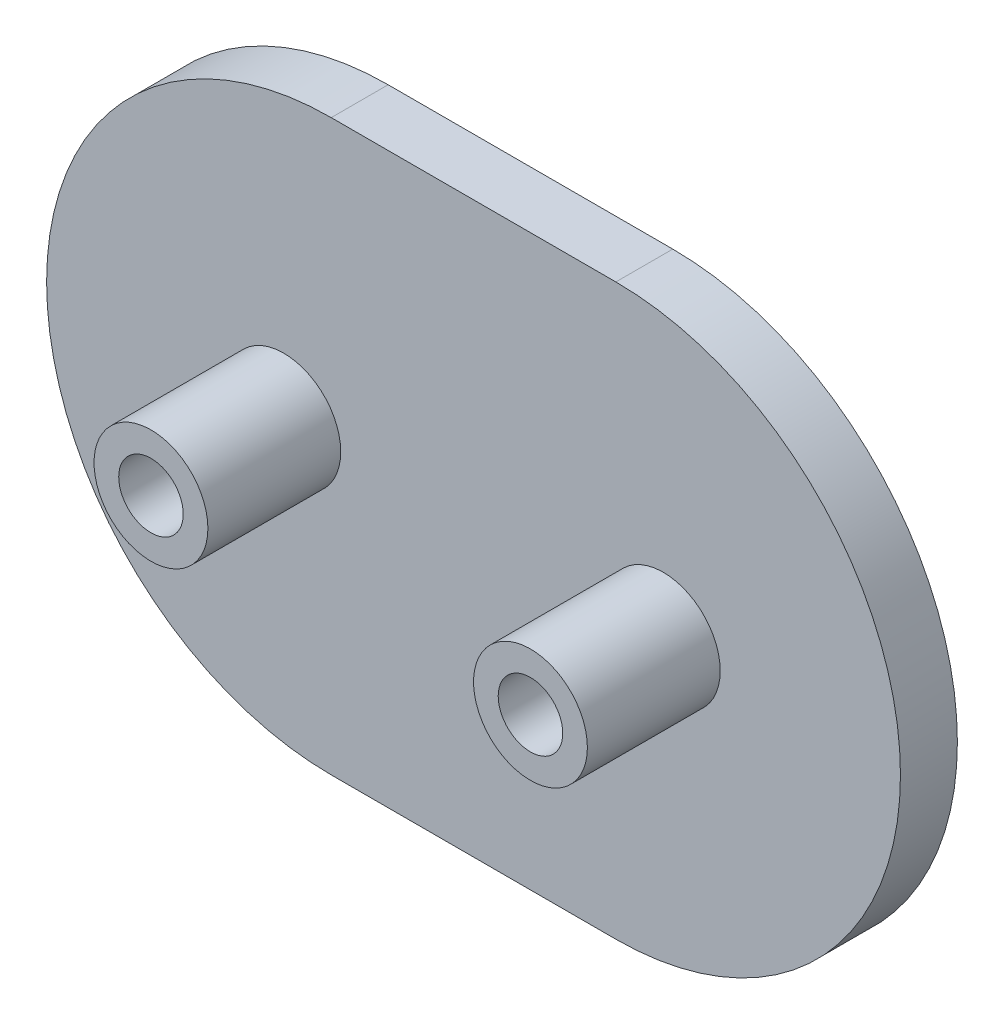
ISO-10303-21;
HEADER;
FILE_DESCRIPTION(('STEP AP214'),'2;1');
FILE_NAME('part.step','',(''),(''),'','','');
FILE_SCHEMA(('AUTOMOTIVE_DESIGN { 1 0 10303 214 1 1 1 1 }'));
ENDSEC;
DATA;
#1=APPLICATION_CONTEXT('core data for automotive mechanical design processes');
#2=APPLICATION_PROTOCOL_DEFINITION('international standard','automotive_design',2000,#1);
#3=PRODUCT_CONTEXT('',#1,'mechanical');
#4=PRODUCT('Part','Part','',(#3));
#5=PRODUCT_RELATED_PRODUCT_CATEGORY('part','',(#4));
#6=PRODUCT_DEFINITION_FORMATION('','',#4);
#7=PRODUCT_DEFINITION_CONTEXT('part definition',#1,'design');
#8=PRODUCT_DEFINITION('design','',#6,#7);
#9=PRODUCT_DEFINITION_SHAPE('','',#8);
#10=(LENGTH_UNIT() NAMED_UNIT(*) SI_UNIT(.MILLI.,.METRE.));
#11=(NAMED_UNIT(*) PLANE_ANGLE_UNIT() SI_UNIT($,.RADIAN.));
#12=(NAMED_UNIT(*) SI_UNIT($,.STERADIAN.) SOLID_ANGLE_UNIT());
#13=UNCERTAINTY_MEASURE_WITH_UNIT(LENGTH_MEASURE(1.E-05),#10,'distance_accuracy_value','');
#14=(GEOMETRIC_REPRESENTATION_CONTEXT(3) GLOBAL_UNCERTAINTY_ASSIGNED_CONTEXT((#13)) GLOBAL_UNIT_ASSIGNED_CONTEXT((#10,
#11,#12)) REPRESENTATION_CONTEXT('',''));
#15=CARTESIAN_POINT('',(0.,0.,0.));
#16=DIRECTION('',(0.,0.,1.));
#17=DIRECTION('',(1.,0.,0.));
#18=AXIS2_PLACEMENT_3D('',#15,#16,#17);
#19=CARTESIAN_POINT('',(0.,-15.,3.));
#20=DIRECTION('',(0.,1.,0.));
#21=DIRECTION('',(0.,0.,1.));
#22=AXIS2_PLACEMENT_3D('',#19,#20,#21);
#23=PLANE('',#22);
#24=DIRECTION('',(1.,0.,0.));
#25=VECTOR('',#24,1.);
#26=CARTESIAN_POINT('',(0.,-15.,0.));
#27=LINE('',#26,#25);
#28=CARTESIAN_POINT('',(-7.5,-15.,0.));
#29=VERTEX_POINT('',#28);
#30=CARTESIAN_POINT('',(7.5,-15.,0.));
#31=VERTEX_POINT('',#30);
#32=EDGE_CURVE('E107',#29,#31,#27,.T.);
#33=ORIENTED_EDGE('',*,*,#32,.T.);
#34=DIRECTION('',(0.,0.,-1.));
#35=VECTOR('',#34,1.);
#36=CARTESIAN_POINT('',(7.5,-15.,3.));
#37=LINE('',#36,#35);
#38=CARTESIAN_POINT('',(7.5,-15.,3.));
#39=VERTEX_POINT('',#38);
#40=EDGE_CURVE('E99',#39,#31,#37,.T.);
#41=ORIENTED_EDGE('',*,*,#40,.F.);
#42=DIRECTION('',(1.,0.,0.));
#43=VECTOR('',#42,1.);
#44=CARTESIAN_POINT('',(0.,-15.,3.));
#45=LINE('',#44,#43);
#46=CARTESIAN_POINT('',(-7.5,-15.,3.));
#47=VERTEX_POINT('',#46);
#48=EDGE_CURVE('E89',#47,#39,#45,.T.);
#49=ORIENTED_EDGE('',*,*,#48,.F.);
#50=DIRECTION('',(0.,0.,-1.));
#51=VECTOR('',#50,1.);
#52=CARTESIAN_POINT('',(-7.5,-15.,3.));
#53=LINE('',#52,#51);
#54=EDGE_CURVE('E103',#47,#29,#53,.T.);
#55=ORIENTED_EDGE('',*,*,#54,.T.);
#56=EDGE_LOOP('',(#33,#41,#49,#55));
#57=FACE_BOUND('',#56,.T.);
#58=ADVANCED_FACE('F39',(#57),#23,.F.);
#59=CARTESIAN_POINT('',(7.5,0.,3.));
#60=DIRECTION('',(0.,0.,-1.));
#61=DIRECTION('',(-1.,0.,0.));
#62=AXIS2_PLACEMENT_3D('',#59,#60,#61);
#63=CYLINDRICAL_SURFACE('',#62,15.);
#64=CARTESIAN_POINT('',(7.5,0.,0.));
#65=DIRECTION('',(0.,0.,1.));
#66=DIRECTION('',(1.,0.,0.));
#67=AXIS2_PLACEMENT_3D('',#64,#65,#66);
#68=CIRCLE('',#67,15.);
#69=CARTESIAN_POINT('',(7.5,15.,0.));
#70=VERTEX_POINT('',#69);
#71=EDGE_CURVE('E95',#31,#70,#68,.T.);
#72=ORIENTED_EDGE('',*,*,#71,.T.);
#73=DIRECTION('',(0.,0.,-1.));
#74=VECTOR('',#73,1.);
#75=CARTESIAN_POINT('',(7.5,15.,3.));
#76=LINE('',#75,#74);
#77=CARTESIAN_POINT('',(7.5,15.,3.));
#78=VERTEX_POINT('',#77);
#79=EDGE_CURVE('E93',#78,#70,#76,.T.);
#80=ORIENTED_EDGE('',*,*,#79,.F.);
#81=CARTESIAN_POINT('',(7.5,0.,3.));
#82=DIRECTION('',(0.,0.,1.));
#83=DIRECTION('',(1.,0.,0.));
#84=AXIS2_PLACEMENT_3D('',#81,#82,#83);
#85=CIRCLE('',#84,15.);
#86=EDGE_CURVE('E84',#39,#78,#85,.T.);
#87=ORIENTED_EDGE('',*,*,#86,.F.);
#88=ORIENTED_EDGE('',*,*,#40,.T.);
#89=EDGE_LOOP('',(#72,#80,#87,#88));
#90=FACE_BOUND('',#89,.T.);
#91=ADVANCED_FACE('F94',(#90),#63,.T.);
#92=CARTESIAN_POINT('',(0.,15.,3.));
#93=DIRECTION('',(0.,1.,0.));
#94=DIRECTION('',(0.,0.,1.));
#95=AXIS2_PLACEMENT_3D('',#92,#93,#94);
#96=PLANE('',#95);
#97=DIRECTION('',(1.,0.,0.));
#98=VECTOR('',#97,1.);
#99=CARTESIAN_POINT('',(0.,15.,0.));
#100=LINE('',#99,#98);
#101=CARTESIAN_POINT('',(-7.5,15.,0.));
#102=VERTEX_POINT('',#101);
#103=EDGE_CURVE('E112',#102,#70,#100,.T.);
#104=ORIENTED_EDGE('',*,*,#103,.F.);
#105=DIRECTION('',(0.,0.,-1.));
#106=VECTOR('',#105,1.);
#107=CARTESIAN_POINT('',(-7.5,15.,3.));
#108=LINE('',#107,#106);
#109=CARTESIAN_POINT('',(-7.5,15.,3.));
#110=VERTEX_POINT('',#109);
#111=EDGE_CURVE('E73',#110,#102,#108,.T.);
#112=ORIENTED_EDGE('',*,*,#111,.F.);
#113=DIRECTION('',(1.,0.,0.));
#114=VECTOR('',#113,1.);
#115=CARTESIAN_POINT('',(0.,15.,3.));
#116=LINE('',#115,#114);
#117=EDGE_CURVE('E87',#110,#78,#116,.T.);
#118=ORIENTED_EDGE('',*,*,#117,.T.);
#119=ORIENTED_EDGE('',*,*,#79,.T.);
#120=EDGE_LOOP('',(#104,#112,#118,#119));
#121=FACE_BOUND('',#120,.T.);
#122=ADVANCED_FACE('F101',(#121),#96,.T.);
#123=CARTESIAN_POINT('',(-7.5,0.,3.));
#124=DIRECTION('',(0.,0.,-1.));
#125=DIRECTION('',(-1.,0.,0.));
#126=AXIS2_PLACEMENT_3D('',#123,#124,#125);
#127=CYLINDRICAL_SURFACE('',#126,15.);
#128=CARTESIAN_POINT('',(-7.5,0.,0.));
#129=DIRECTION('',(0.,0.,1.));
#130=DIRECTION('',(1.,0.,0.));
#131=AXIS2_PLACEMENT_3D('',#128,#129,#130);
#132=CIRCLE('',#131,15.);
#133=EDGE_CURVE('E76',#102,#29,#132,.T.);
#134=ORIENTED_EDGE('',*,*,#133,.T.);
#135=ORIENTED_EDGE('',*,*,#54,.F.);
#136=CARTESIAN_POINT('',(-7.5,0.,3.));
#137=DIRECTION('',(0.,0.,1.));
#138=DIRECTION('',(1.,0.,0.));
#139=AXIS2_PLACEMENT_3D('',#136,#137,#138);
#140=CIRCLE('',#139,15.);
#141=EDGE_CURVE('E57',#110,#47,#140,.T.);
#142=ORIENTED_EDGE('',*,*,#141,.F.);
#143=ORIENTED_EDGE('',*,*,#111,.T.);
#144=EDGE_LOOP('',(#134,#135,#142,#143));
#145=FACE_BOUND('',#144,.T.);
#146=ADVANCED_FACE('F145',(#145),#127,.T.);
#147=CARTESIAN_POINT('',(0.,0.,3.));
#148=DIRECTION('',(0.,0.,1.));
#149=DIRECTION('',(1.,0.,0.));
#150=AXIS2_PLACEMENT_3D('',#147,#148,#149);
#151=PLANE('',#150);
#152=CARTESIAN_POINT('',(10.,0.,3.));
#153=DIRECTION('',(0.,0.,1.));
#154=DIRECTION('',(1.,0.,0.));
#155=AXIS2_PLACEMENT_3D('',#152,#153,#154);
#156=CIRCLE('',#155,3.);
#157=CARTESIAN_POINT('',(13.,0.,3.));
#158=VERTEX_POINT('',#157);
#159=EDGE_CURVE('E115',#158,#158,#156,.T.);
#160=ORIENTED_EDGE('',*,*,#159,.F.);
#161=EDGE_LOOP('',(#160));
#162=FACE_BOUND('',#161,.T.);
#163=CARTESIAN_POINT('',(-10.,0.,3.));
#164=DIRECTION('',(0.,0.,1.));
#165=DIRECTION('',(1.,0.,0.));
#166=AXIS2_PLACEMENT_3D('',#163,#164,#165);
#167=CIRCLE('',#166,3.);
#168=CARTESIAN_POINT('',(-7.,0.,3.));
#169=VERTEX_POINT('',#168);
#170=EDGE_CURVE('E272',#169,#169,#167,.T.);
#171=ORIENTED_EDGE('',*,*,#170,.F.);
#172=EDGE_LOOP('',(#171));
#173=FACE_BOUND('',#172,.T.);
#174=ORIENTED_EDGE('',*,*,#48,.T.);
#175=ORIENTED_EDGE('',*,*,#86,.T.);
#176=ORIENTED_EDGE('',*,*,#117,.F.);
#177=ORIENTED_EDGE('',*,*,#141,.T.);
#178=EDGE_LOOP('',(#174,#175,#176,#177));
#179=FACE_BOUND('',#178,.T.);
#180=ADVANCED_FACE('F85',(#162,#173,#179),#151,.T.);
#181=CARTESIAN_POINT('',(0.,0.,0.));
#182=DIRECTION('',(0.,0.,1.));
#183=DIRECTION('',(1.,0.,0.));
#184=AXIS2_PLACEMENT_3D('',#181,#182,#183);
#185=PLANE('',#184);
#186=CARTESIAN_POINT('',(10.,0.,0.));
#187=DIRECTION('',(0.,0.,1.));
#188=DIRECTION('',(1.,0.,0.));
#189=AXIS2_PLACEMENT_3D('',#186,#187,#188);
#190=CIRCLE('',#189,3.09999999999999);
#191=CARTESIAN_POINT('',(6.90000000000001,0.,0.));
#192=VERTEX_POINT('',#191);
#193=EDGE_CURVE('E122',#192,#192,#190,.T.);
#194=ORIENTED_EDGE('',*,*,#193,.T.);
#195=EDGE_LOOP('',(#194));
#196=FACE_BOUND('',#195,.T.);
#197=CARTESIAN_POINT('',(-10.,0.,0.));
#198=DIRECTION('',(0.,0.,1.));
#199=DIRECTION('',(1.,0.,0.));
#200=AXIS2_PLACEMENT_3D('',#197,#198,#199);
#201=CIRCLE('',#200,3.09999999999999);
#202=CARTESIAN_POINT('',(-13.1,0.,0.));
#203=VERTEX_POINT('',#202);
#204=EDGE_CURVE('E119',#203,#203,#201,.T.);
#205=ORIENTED_EDGE('',*,*,#204,.T.);
#206=EDGE_LOOP('',(#205));
#207=FACE_BOUND('',#206,.T.);
#208=ORIENTED_EDGE('',*,*,#32,.F.);
#209=ORIENTED_EDGE('',*,*,#133,.F.);
#210=ORIENTED_EDGE('',*,*,#103,.T.);
#211=ORIENTED_EDGE('',*,*,#71,.F.);
#212=EDGE_LOOP('',(#208,#209,#210,#211));
#213=FACE_BOUND('',#212,.T.);
#214=ADVANCED_FACE('F136',(#196,#207,#213),#185,.F.);
#215=CARTESIAN_POINT('',(-10.,0.,10.));
#216=DIRECTION('',(0.,0.,-1.));
#217=DIRECTION('',(-1.,0.,0.));
#218=AXIS2_PLACEMENT_3D('',#215,#216,#217);
#219=CYLINDRICAL_SURFACE('',#218,3.);
#220=ORIENTED_EDGE('',*,*,#170,.T.);
#221=EDGE_LOOP('',(#220));
#222=FACE_BOUND('',#221,.T.);
#223=CARTESIAN_POINT('',(-10.,0.,10.));
#224=DIRECTION('',(0.,0.,1.));
#225=DIRECTION('',(1.,0.,0.));
#226=AXIS2_PLACEMENT_3D('',#223,#224,#225);
#227=CIRCLE('',#226,3.);
#228=CARTESIAN_POINT('',(-7.,0.,10.));
#229=VERTEX_POINT('',#228);
#230=EDGE_CURVE('E263',#229,#229,#227,.T.);
#231=ORIENTED_EDGE('',*,*,#230,.F.);
#232=EDGE_LOOP('',(#231));
#233=FACE_BOUND('',#232,.T.);
#234=ADVANCED_FACE('F139',(#222,#233),#219,.T.);
#235=CARTESIAN_POINT('',(-10.,0.,10.));
#236=DIRECTION('',(0.,0.,-1.));
#237=DIRECTION('',(-1.,0.,0.));
#238=AXIS2_PLACEMENT_3D('',#235,#236,#237);
#239=CYLINDRICAL_SURFACE('',#238,1.7);
#240=CARTESIAN_POINT('',(-10.,0.,1.4));
#241=DIRECTION('',(0.,0.,1.));
#242=DIRECTION('',(1.,0.,0.));
#243=AXIS2_PLACEMENT_3D('',#240,#241,#242);
#244=CIRCLE('',#243,1.7);
#245=CARTESIAN_POINT('',(-11.7,0.,1.4));
#246=VERTEX_POINT('',#245);
#247=EDGE_CURVE('E11',#246,#246,#244,.F.);
#248=ORIENTED_EDGE('',*,*,#247,.T.);
#249=EDGE_LOOP('',(#248));
#250=FACE_BOUND('',#249,.T.);
#251=CARTESIAN_POINT('',(-10.,0.,10.));
#252=DIRECTION('',(0.,0.,1.));
#253=DIRECTION('',(1.,0.,0.));
#254=AXIS2_PLACEMENT_3D('',#251,#252,#253);
#255=CIRCLE('',#254,1.7);
#256=CARTESIAN_POINT('',(-8.3,0.,10.));
#257=VERTEX_POINT('',#256);
#258=EDGE_CURVE('E110',#257,#257,#255,.T.);
#259=ORIENTED_EDGE('',*,*,#258,.T.);
#260=EDGE_LOOP('',(#259));
#261=FACE_BOUND('',#260,.T.);
#262=ADVANCED_FACE('F193',(#250,#261),#239,.F.);
#263=CARTESIAN_POINT('',(0.,0.,10.));
#264=DIRECTION('',(0.,0.,1.));
#265=DIRECTION('',(1.,0.,0.));
#266=AXIS2_PLACEMENT_3D('',#263,#264,#265);
#267=PLANE('',#266);
#268=ORIENTED_EDGE('',*,*,#230,.T.);
#269=EDGE_LOOP('',(#268));
#270=FACE_BOUND('',#269,.T.);
#271=ORIENTED_EDGE('',*,*,#258,.F.);
#272=EDGE_LOOP('',(#271));
#273=FACE_BOUND('',#272,.T.);
#274=ADVANCED_FACE('F202',(#270,#273),#267,.T.);
#275=CARTESIAN_POINT('',(10.,0.,10.));
#276=DIRECTION('',(0.,0.,-1.));
#277=DIRECTION('',(-1.,0.,0.));
#278=AXIS2_PLACEMENT_3D('',#275,#276,#277);
#279=CYLINDRICAL_SURFACE('',#278,1.7);
#280=CARTESIAN_POINT('',(10.,0.,1.4));
#281=DIRECTION('',(0.,0.,1.));
#282=DIRECTION('',(1.,0.,0.));
#283=AXIS2_PLACEMENT_3D('',#280,#281,#282);
#284=CIRCLE('',#283,1.7);
#285=CARTESIAN_POINT('',(8.3,0.,1.4));
#286=VERTEX_POINT('',#285);
#287=EDGE_CURVE('E49',#286,#286,#284,.F.);
#288=ORIENTED_EDGE('',*,*,#287,.T.);
#289=EDGE_LOOP('',(#288));
#290=FACE_BOUND('',#289,.T.);
#291=CARTESIAN_POINT('',(10.,0.,10.));
#292=DIRECTION('',(0.,0.,1.));
#293=DIRECTION('',(1.,0.,0.));
#294=AXIS2_PLACEMENT_3D('',#291,#292,#293);
#295=CIRCLE('',#294,1.7);
#296=CARTESIAN_POINT('',(11.7,0.,10.));
#297=VERTEX_POINT('',#296);
#298=EDGE_CURVE('E283',#297,#297,#295,.T.);
#299=ORIENTED_EDGE('',*,*,#298,.T.);
#300=EDGE_LOOP('',(#299));
#301=FACE_BOUND('',#300,.T.);
#302=ADVANCED_FACE('F127',(#290,#301),#279,.F.);
#303=CARTESIAN_POINT('',(10.,0.,10.));
#304=DIRECTION('',(0.,0.,-1.));
#305=DIRECTION('',(-1.,0.,0.));
#306=AXIS2_PLACEMENT_3D('',#303,#304,#305);
#307=CYLINDRICAL_SURFACE('',#306,3.);
#308=ORIENTED_EDGE('',*,*,#159,.T.);
#309=EDGE_LOOP('',(#308));
#310=FACE_BOUND('',#309,.T.);
#311=CARTESIAN_POINT('',(10.,0.,10.));
#312=DIRECTION('',(0.,0.,1.));
#313=DIRECTION('',(1.,0.,0.));
#314=AXIS2_PLACEMENT_3D('',#311,#312,#313);
#315=CIRCLE('',#314,3.);
#316=CARTESIAN_POINT('',(13.,0.,10.));
#317=VERTEX_POINT('',#316);
#318=EDGE_CURVE('E266',#317,#317,#315,.T.);
#319=ORIENTED_EDGE('',*,*,#318,.F.);
#320=EDGE_LOOP('',(#319));
#321=FACE_BOUND('',#320,.T.);
#322=ADVANCED_FACE('F214',(#310,#321),#307,.T.);
#323=CARTESIAN_POINT('',(0.,0.,10.));
#324=DIRECTION('',(0.,0.,1.));
#325=DIRECTION('',(1.,0.,0.));
#326=AXIS2_PLACEMENT_3D('',#323,#324,#325);
#327=PLANE('',#326);
#328=ORIENTED_EDGE('',*,*,#298,.F.);
#329=EDGE_LOOP('',(#328));
#330=FACE_BOUND('',#329,.T.);
#331=ORIENTED_EDGE('',*,*,#318,.T.);
#332=EDGE_LOOP('',(#331));
#333=FACE_BOUND('',#332,.T.);
#334=ADVANCED_FACE('F133',(#330,#333),#327,.T.);
#335=CARTESIAN_POINT('',(10.,0.,0.));
#336=DIRECTION('',(0.,0.,-1.));
#337=DIRECTION('',(-1.,0.,0.));
#338=AXIS2_PLACEMENT_3D('',#335,#336,#337);
#339=CONICAL_SURFACE('',#338,3.09999999999999,0.785398163397446);
#340=CARTESIAN_POINT('',(8.3,0.,1.4));
#341=CARTESIAN_POINT('',(8.28541666666667,0.,1.38541666666666));
#342=CARTESIAN_POINT('',(8.27083333333334,0.,1.37083333333333));
#343=CARTESIAN_POINT('',(8.24166666666667,0.,1.34166666666666));
#344=CARTESIAN_POINT('',(8.22708333333333,0.,1.32708333333333));
#345=CARTESIAN_POINT('',(8.19791666666667,0.,1.29791666666667));
#346=CARTESIAN_POINT('',(8.18333333333333,0.,1.28333333333333));
#347=CARTESIAN_POINT('',(8.15416666666667,0.,1.25416666666667));
#348=CARTESIAN_POINT('',(8.13958333333334,0.,1.23958333333333));
#349=CARTESIAN_POINT('',(8.11041666666667,0.,1.21041666666666));
#350=CARTESIAN_POINT('',(8.09583333333333,0.,1.19583333333333));
#351=CARTESIAN_POINT('',(8.06666666666667,0.,1.16666666666667));
#352=CARTESIAN_POINT('',(8.05208333333334,0.,1.15208333333333));
#353=CARTESIAN_POINT('',(8.02291666666667,0.,1.12291666666667));
#354=CARTESIAN_POINT('',(8.00833333333334,0.,1.10833333333333));
#355=CARTESIAN_POINT('',(7.97916666666667,0.,1.07916666666667));
#356=CARTESIAN_POINT('',(7.96458333333334,0.,1.06458333333333));
#357=CARTESIAN_POINT('',(7.93541666666667,0.,1.03541666666667));
#358=CARTESIAN_POINT('',(7.92083333333334,0.,1.02083333333333));
#359=CARTESIAN_POINT('',(7.89166666666667,0.,0.991666666666665));
#360=CARTESIAN_POINT('',(7.87708333333334,0.,0.977083333333332));
#361=CARTESIAN_POINT('',(7.84791666666667,0.,0.947916666666666));
#362=CARTESIAN_POINT('',(7.83333333333334,0.,0.933333333333332));
#363=CARTESIAN_POINT('',(7.80416666666667,0.,0.904166666666666));
#364=CARTESIAN_POINT('',(7.78958333333334,0.,0.889583333333332));
#365=CARTESIAN_POINT('',(7.76041666666667,0.,0.860416666666665));
#366=CARTESIAN_POINT('',(7.74583333333334,0.,0.845833333333332));
#367=CARTESIAN_POINT('',(7.71666666666667,0.,0.816666666666666));
#368=CARTESIAN_POINT('',(7.70208333333334,0.,0.802083333333332));
#369=CARTESIAN_POINT('',(7.67291666666667,0.,0.772916666666666));
#370=CARTESIAN_POINT('',(7.65833333333334,0.,0.758333333333332));
#371=CARTESIAN_POINT('',(7.62916666666667,0.,0.729166666666666));
#372=CARTESIAN_POINT('',(7.61458333333334,0.,0.714583333333332));
#373=CARTESIAN_POINT('',(7.58541666666667,0.,0.685416666666666));
#374=CARTESIAN_POINT('',(7.57083333333334,0.,0.670833333333332));
#375=CARTESIAN_POINT('',(7.54166666666667,0.,0.641666666666666));
#376=CARTESIAN_POINT('',(7.52708333333334,0.,0.627083333333333));
#377=CARTESIAN_POINT('',(7.49791666666667,0.,0.597916666666666));
#378=CARTESIAN_POINT('',(7.48333333333334,0.,0.583333333333333));
#379=CARTESIAN_POINT('',(7.45416666666667,0.,0.554166666666666));
#380=CARTESIAN_POINT('',(7.43958333333334,0.,0.539583333333332));
#381=CARTESIAN_POINT('',(7.41041666666667,0.,0.510416666666666));
#382=CARTESIAN_POINT('',(7.39583333333334,0.,0.495833333333333));
#383=CARTESIAN_POINT('',(7.36666666666667,0.,0.466666666666666));
#384=CARTESIAN_POINT('',(7.35208333333334,0.,0.452083333333333));
#385=CARTESIAN_POINT('',(7.32291666666667,0.,0.422916666666666));
#386=CARTESIAN_POINT('',(7.30833333333334,0.,0.408333333333333));
#387=CARTESIAN_POINT('',(7.27916666666667,0.,0.379166666666666));
#388=CARTESIAN_POINT('',(7.26458333333334,0.,0.364583333333333));
#389=CARTESIAN_POINT('',(7.23541666666667,0.,0.335416666666666));
#390=CARTESIAN_POINT('',(7.22083333333334,0.,0.320833333333333));
#391=CARTESIAN_POINT('',(7.19166666666667,0.,0.291666666666666));
#392=CARTESIAN_POINT('',(7.17708333333334,0.,0.277083333333333));
#393=CARTESIAN_POINT('',(7.14791666666667,0.,0.247916666666666));
#394=CARTESIAN_POINT('',(7.13333333333334,0.,0.233333333333333));
#395=CARTESIAN_POINT('',(7.10416666666667,0.,0.204166666666666));
#396=CARTESIAN_POINT('',(7.08958333333334,0.,0.189583333333333));
#397=CARTESIAN_POINT('',(7.06041666666667,0.,0.160416666666666));
#398=CARTESIAN_POINT('',(7.04583333333334,0.,0.145833333333333));
#399=CARTESIAN_POINT('',(7.01666666666668,0.,0.116666666666667));
#400=CARTESIAN_POINT('',(7.00208333333334,0.,0.102083333333333));
#401=CARTESIAN_POINT('',(6.97291666666668,0.,0.0729166666666664));
#402=CARTESIAN_POINT('',(6.95833333333334,0.,0.0583333333333332));
#403=CARTESIAN_POINT('',(6.92916666666668,0.,0.0291666666666669));
#404=CARTESIAN_POINT('',(6.91458333333334,0.,0.0145833333333337));
#405=CARTESIAN_POINT('',(6.90000000000001,0.,0.));
#406=B_SPLINE_CURVE_WITH_KNOTS('',3,(#340,#341,#342,#343,#344,#345,#346,#347,#348,#349,#350,
#351,#352,#353,#354,#355,#356,#357,#358,#359,#360,#361,#362,#363,#364,#365,#366,#367,#368,#369,
#370,#371,#372,#373,#374,#375,#376,#377,#378,#379,#380,#381,#382,#383,#384,#385,#386,#387,#388,
#389,#390,#391,#392,#393,#394,#395,#396,#397,#398,#399,#400,#401,#402,#403,#404,#405),
.UNSPECIFIED.,.F.,.F.,(4,2,2,2,2,2,2,2,2,2,2,2,2,2,2,2,2,2,2,2,2,2,2,2,2,2,2,2,2,2,2,2,4),(0.,
0.0618718433538219,0.123743686707645,0.185615530061468,0.24748737341529,0.309359216769113,
0.371231060122935,0.433102903476758,0.494974746830581,0.556846590184403,0.618718433538226,
0.68059027689205,0.742462120245871,0.804333963599695,0.866205806953517,0.92807765030734,
0.989949493661162,1.05182133701498,1.11369318036881,1.17556502372263,1.23743686707645,
1.29930871043028,1.3611805537841,1.42305239713792,1.48492424049174,1.54679608384557,
1.60866792719939,1.67053977055321,1.73241161390703,1.79428345726086,1.85615530061468,
1.9180271439685,1.97989898732233),.UNSPECIFIED.);
#407=EDGE_CURVE('BSEAM130',#286,#192,#406,.T.);
#408=ORIENTED_EDGE('',*,*,#287,.F.);
#409=ORIENTED_EDGE('',*,*,#193,.F.);
#410=ORIENTED_EDGE('',*,*,#407,.T.);
#411=ORIENTED_EDGE('',*,*,#407,.F.);
#412=EDGE_LOOP('',(#408,#410,#409,#411));
#413=FACE_BOUND('',#412,.T.);
#414=ADVANCED_FACE('F130',(#413),#339,.F.);
#415=CARTESIAN_POINT('',(-10.,0.,0.));
#416=DIRECTION('',(0.,0.,-1.));
#417=DIRECTION('',(-1.,0.,0.));
#418=AXIS2_PLACEMENT_3D('',#415,#416,#417);
#419=CONICAL_SURFACE('',#418,3.09999999999999,0.785398163397446);
#420=CARTESIAN_POINT('',(-11.7,0.,1.4));
#421=CARTESIAN_POINT('',(-11.7145833333333,0.,1.38541666666666));
#422=CARTESIAN_POINT('',(-11.7291666666667,0.,1.37083333333333));
#423=CARTESIAN_POINT('',(-11.7583333333333,0.,1.34166666666667));
#424=CARTESIAN_POINT('',(-11.7729166666667,0.,1.32708333333333));
#425=CARTESIAN_POINT('',(-11.8020833333333,0.,1.29791666666667));
#426=CARTESIAN_POINT('',(-11.8166666666667,0.,1.28333333333333));
#427=CARTESIAN_POINT('',(-11.8458333333333,0.,1.25416666666666));
#428=CARTESIAN_POINT('',(-11.8604166666667,0.,1.23958333333333));
#429=CARTESIAN_POINT('',(-11.8895833333333,0.,1.21041666666667));
#430=CARTESIAN_POINT('',(-11.9041666666667,0.,1.19583333333333));
#431=CARTESIAN_POINT('',(-11.9333333333333,0.,1.16666666666667));
#432=CARTESIAN_POINT('',(-11.9479166666667,0.,1.15208333333333));
#433=CARTESIAN_POINT('',(-11.9770833333333,0.,1.12291666666667));
#434=CARTESIAN_POINT('',(-11.9916666666667,0.,1.10833333333333));
#435=CARTESIAN_POINT('',(-12.0208333333333,0.,1.07916666666667));
#436=CARTESIAN_POINT('',(-12.0354166666667,0.,1.06458333333333));
#437=CARTESIAN_POINT('',(-12.0645833333333,0.,1.03541666666667));
#438=CARTESIAN_POINT('',(-12.0791666666667,0.,1.02083333333333));
#439=CARTESIAN_POINT('',(-12.1083333333333,0.,0.991666666666665));
#440=CARTESIAN_POINT('',(-12.1229166666667,0.,0.977083333333332));
#441=CARTESIAN_POINT('',(-12.1520833333333,0.,0.947916666666665));
#442=CARTESIAN_POINT('',(-12.1666666666667,0.,0.933333333333332));
#443=CARTESIAN_POINT('',(-12.1958333333333,0.,0.904166666666666));
#444=CARTESIAN_POINT('',(-12.2104166666667,0.,0.889583333333332));
#445=CARTESIAN_POINT('',(-12.2395833333333,0.,0.860416666666666));
#446=CARTESIAN_POINT('',(-12.2541666666667,0.,0.845833333333332));
#447=CARTESIAN_POINT('',(-12.2833333333333,0.,0.816666666666666));
#448=CARTESIAN_POINT('',(-12.2979166666667,0.,0.802083333333332));
#449=CARTESIAN_POINT('',(-12.3270833333333,0.,0.772916666666666));
#450=CARTESIAN_POINT('',(-12.3416666666667,0.,0.758333333333333));
#451=CARTESIAN_POINT('',(-12.3708333333333,0.,0.729166666666666));
#452=CARTESIAN_POINT('',(-12.3854166666667,0.,0.714583333333332));
#453=CARTESIAN_POINT('',(-12.4145833333333,0.,0.685416666666666));
#454=CARTESIAN_POINT('',(-12.4291666666667,0.,0.670833333333332));
#455=CARTESIAN_POINT('',(-12.4583333333333,0.,0.641666666666666));
#456=CARTESIAN_POINT('',(-12.4729166666667,0.,0.627083333333333));
#457=CARTESIAN_POINT('',(-12.5020833333333,0.,0.597916666666666));
#458=CARTESIAN_POINT('',(-12.5166666666667,0.,0.583333333333332));
#459=CARTESIAN_POINT('',(-12.5458333333333,0.,0.554166666666666));
#460=CARTESIAN_POINT('',(-12.5604166666667,0.,0.539583333333333));
#461=CARTESIAN_POINT('',(-12.5895833333333,0.,0.510416666666666));
#462=CARTESIAN_POINT('',(-12.6041666666667,0.,0.495833333333333));
#463=CARTESIAN_POINT('',(-12.6333333333333,0.,0.466666666666666));
#464=CARTESIAN_POINT('',(-12.6479166666667,0.,0.452083333333333));
#465=CARTESIAN_POINT('',(-12.6770833333333,0.,0.422916666666666));
#466=CARTESIAN_POINT('',(-12.6916666666667,0.,0.408333333333333));
#467=CARTESIAN_POINT('',(-12.7208333333333,0.,0.379166666666666));
#468=CARTESIAN_POINT('',(-12.7354166666667,0.,0.364583333333333));
#469=CARTESIAN_POINT('',(-12.7645833333333,0.,0.335416666666666));
#470=CARTESIAN_POINT('',(-12.7791666666667,0.,0.320833333333333));
#471=CARTESIAN_POINT('',(-12.8083333333333,0.,0.291666666666666));
#472=CARTESIAN_POINT('',(-12.8229166666667,0.,0.277083333333333));
#473=CARTESIAN_POINT('',(-12.8520833333333,0.,0.247916666666666));
#474=CARTESIAN_POINT('',(-12.8666666666667,0.,0.233333333333333));
#475=CARTESIAN_POINT('',(-12.8958333333333,0.,0.204166666666667));
#476=CARTESIAN_POINT('',(-12.9104166666667,0.,0.189583333333333));
#477=CARTESIAN_POINT('',(-12.9395833333333,0.,0.160416666666667));
#478=CARTESIAN_POINT('',(-12.9541666666667,0.,0.145833333333333));
#479=CARTESIAN_POINT('',(-12.9833333333333,0.,0.116666666666666));
#480=CARTESIAN_POINT('',(-12.9979166666667,0.,0.102083333333333));
#481=CARTESIAN_POINT('',(-13.0270833333333,0.,0.0729166666666666));
#482=CARTESIAN_POINT('',(-13.0416666666667,0.,0.0583333333333334));
#483=CARTESIAN_POINT('',(-13.0708333333333,0.,0.0291666666666668));
#484=CARTESIAN_POINT('',(-13.0854166666667,0.,0.0145833333333335));
#485=CARTESIAN_POINT('',(-13.1,0.,0.));
#486=B_SPLINE_CURVE_WITH_KNOTS('',3,(#420,#421,#422,#423,#424,#425,#426,#427,#428,#429,#430,
#431,#432,#433,#434,#435,#436,#437,#438,#439,#440,#441,#442,#443,#444,#445,#446,#447,#448,#449,
#450,#451,#452,#453,#454,#455,#456,#457,#458,#459,#460,#461,#462,#463,#464,#465,#466,#467,#468,
#469,#470,#471,#472,#473,#474,#475,#476,#477,#478,#479,#480,#481,#482,#483,#484,#485),
.UNSPECIFIED.,.F.,.F.,(4,2,2,2,2,2,2,2,2,2,2,2,2,2,2,2,2,2,2,2,2,2,2,2,2,2,2,2,2,2,2,2,4),(0.,
0.0618718433538219,0.123743686707645,0.185615530061467,0.24748737341529,0.309359216769113,
0.371231060122935,0.433102903476758,0.494974746830581,0.556846590184403,0.618718433538225,
0.680590276892048,0.742462120245871,0.804333963599693,0.866205806953516,0.928077650307339,
0.989949493661161,1.05182133701498,1.11369318036881,1.17556502372263,1.23743686707645,
1.29930871043027,1.3611805537841,1.42305239713792,1.48492424049174,1.54679608384557,
1.60866792719939,1.67053977055321,1.73241161390703,1.79428345726086,1.85615530061468,
1.9180271439685,1.97989898732232),.UNSPECIFIED.);
#487=EDGE_CURVE('BSEAM42',#246,#203,#486,.T.);
#488=ORIENTED_EDGE('',*,*,#247,.F.);
#489=ORIENTED_EDGE('',*,*,#204,.F.);
#490=ORIENTED_EDGE('',*,*,#487,.T.);
#491=ORIENTED_EDGE('',*,*,#487,.F.);
#492=EDGE_LOOP('',(#488,#490,#489,#491));
#493=FACE_BOUND('',#492,.T.);
#494=ADVANCED_FACE('F42',(#493),#419,.F.);
#495=CLOSED_SHELL('',(#58,#91,#122,#146,#180,#214,#234,#262,#274,#302,#322,#334,#414,#494));
#496=MANIFOLD_SOLID_BREP('B2',#495);
#497=ADVANCED_BREP_SHAPE_REPRESENTATION('',(#18,#496),#14);
#498=SHAPE_DEFINITION_REPRESENTATION(#9,#497);
ENDSEC;
END-ISO-10303-21;
